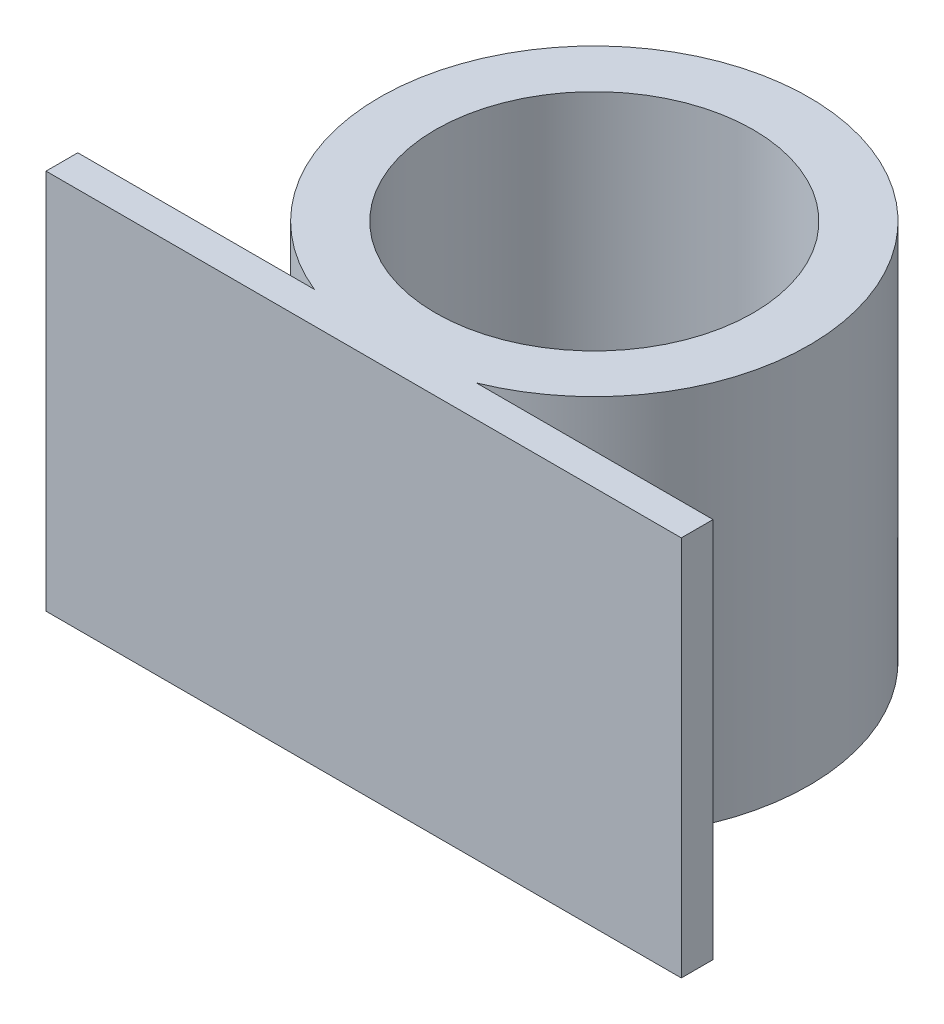
ISO-10303-21;
HEADER;
FILE_DESCRIPTION(('STEP AP214'),'2;1');
FILE_NAME('part.step','',(''),(''),'','','');
FILE_SCHEMA(('AUTOMOTIVE_DESIGN { 1 0 10303 214 1 1 1 1 }'));
ENDSEC;
DATA;
#1=APPLICATION_CONTEXT('core data for automotive mechanical design processes');
#2=APPLICATION_PROTOCOL_DEFINITION('international standard','automotive_design',2000,#1);
#3=PRODUCT_CONTEXT('',#1,'mechanical');
#4=PRODUCT('Part','Part','',(#3));
#5=PRODUCT_RELATED_PRODUCT_CATEGORY('part','',(#4));
#6=PRODUCT_DEFINITION_FORMATION('','',#4);
#7=PRODUCT_DEFINITION_CONTEXT('part definition',#1,'design');
#8=PRODUCT_DEFINITION('design','',#6,#7);
#9=PRODUCT_DEFINITION_SHAPE('','',#8);
#10=(LENGTH_UNIT() NAMED_UNIT(*) SI_UNIT(.MILLI.,.METRE.));
#11=(NAMED_UNIT(*) PLANE_ANGLE_UNIT() SI_UNIT($,.RADIAN.));
#12=(NAMED_UNIT(*) SI_UNIT($,.STERADIAN.) SOLID_ANGLE_UNIT());
#13=UNCERTAINTY_MEASURE_WITH_UNIT(LENGTH_MEASURE(1.E-05),#10,'distance_accuracy_value','');
#14=(GEOMETRIC_REPRESENTATION_CONTEXT(3) GLOBAL_UNCERTAINTY_ASSIGNED_CONTEXT((#13)) GLOBAL_UNIT_ASSIGNED_CONTEXT((#10,
#11,#12)) REPRESENTATION_CONTEXT('',''));
#15=CARTESIAN_POINT('',(0.,0.,0.));
#16=DIRECTION('',(0.,0.,1.));
#17=DIRECTION('',(1.,0.,0.));
#18=AXIS2_PLACEMENT_3D('',#15,#16,#17);
#19=CARTESIAN_POINT('',(0.,20.,0.));
#20=DIRECTION('',(0.,1.,0.));
#21=DIRECTION('',(0.,0.,1.));
#22=AXIS2_PLACEMENT_3D('',#19,#20,#21);
#23=PLANE('',#22);
#24=CARTESIAN_POINT('',(0.,20.,0.));
#25=DIRECTION('',(0.,1.,0.));
#26=DIRECTION('',(0.,0.,1.));
#27=AXIS2_PLACEMENT_3D('',#24,#25,#26);
#28=CIRCLE('',#27,13.5240640700952);
#29=CARTESIAN_POINT('',(5.10373668405712,20.,12.5240640700952));
#30=VERTEX_POINT('',#29);
#31=CARTESIAN_POINT('',(-5.10373668405712,20.,12.5240640700952));
#32=VERTEX_POINT('',#31);
#33=EDGE_CURVE('E136',#30,#32,#28,.T.);
#34=ORIENTED_EDGE('',*,*,#33,.T.);
#35=DIRECTION('',(-1.,0.,0.));
#36=VECTOR('',#35,1.);
#37=CARTESIAN_POINT('',(-20.,20.,12.5240640700952));
#38=LINE('',#37,#36);
#39=CARTESIAN_POINT('',(-20.,20.,12.5240640700952));
#40=VERTEX_POINT('',#39);
#41=EDGE_CURVE('E142',#32,#40,#38,.T.);
#42=ORIENTED_EDGE('',*,*,#41,.T.);
#43=DIRECTION('',(0.,0.,1.));
#44=VECTOR('',#43,1.);
#45=CARTESIAN_POINT('',(-20.,20.,12.5240640700952));
#46=LINE('',#45,#44);
#47=CARTESIAN_POINT('',(-20.,20.,14.5240640700952));
#48=VERTEX_POINT('',#47);
#49=EDGE_CURVE('E98',#40,#48,#46,.T.);
#50=ORIENTED_EDGE('',*,*,#49,.T.);
#51=DIRECTION('',(1.,0.,0.));
#52=VECTOR('',#51,1.);
#53=CARTESIAN_POINT('',(-20.,20.,14.5240640700952));
#54=LINE('',#53,#52);
#55=CARTESIAN_POINT('',(20.,20.,14.5240640700952));
#56=VERTEX_POINT('',#55);
#57=EDGE_CURVE('E147',#48,#56,#54,.T.);
#58=ORIENTED_EDGE('',*,*,#57,.T.);
#59=DIRECTION('',(0.,0.,-1.));
#60=VECTOR('',#59,1.);
#61=CARTESIAN_POINT('',(20.,20.,12.5240640700952));
#62=LINE('',#61,#60);
#63=CARTESIAN_POINT('',(20.,20.,12.5240640700952));
#64=VERTEX_POINT('',#63);
#65=EDGE_CURVE('E60',#56,#64,#62,.T.);
#66=ORIENTED_EDGE('',*,*,#65,.T.);
#67=DIRECTION('',(-1.,0.,0.));
#68=VECTOR('',#67,1.);
#69=CARTESIAN_POINT('',(5.10373668405712,20.,12.5240640700952));
#70=LINE('',#69,#68);
#71=EDGE_CURVE('E55',#64,#30,#70,.T.);
#72=ORIENTED_EDGE('',*,*,#71,.T.);
#73=EDGE_LOOP('',(#34,#42,#50,#58,#66,#72));
#74=FACE_BOUND('',#73,.T.);
#75=CARTESIAN_POINT('',(0.,20.,0.));
#76=DIRECTION('',(0.,1.,0.));
#77=DIRECTION('',(0.,0.,1.));
#78=AXIS2_PLACEMENT_3D('',#75,#76,#77);
#79=CIRCLE('',#78,10.);
#80=CARTESIAN_POINT('',(0.,20.,10.));
#81=VERTEX_POINT('',#80);
#82=EDGE_CURVE('E132',#81,#81,#79,.T.);
#83=ORIENTED_EDGE('',*,*,#82,.F.);
#84=EDGE_LOOP('',(#83));
#85=FACE_BOUND('',#84,.T.);
#86=ADVANCED_FACE('F39',(#74,#85),#23,.T.);
#87=CARTESIAN_POINT('',(0.,20.,0.));
#88=DIRECTION('',(0.,-1.,0.));
#89=DIRECTION('',(0.,0.,-1.));
#90=AXIS2_PLACEMENT_3D('',#87,#88,#89);
#91=CYLINDRICAL_SURFACE('',#90,13.5240640700952);
#92=DIRECTION('',(0.,-1.,0.));
#93=VECTOR('',#92,1.);
#94=CARTESIAN_POINT('',(5.10373668405712,20.,12.5240640700952));
#95=LINE('',#94,#93);
#96=CARTESIAN_POINT('',(5.10373668405712,-4.,12.5240640700952));
#97=VERTEX_POINT('',#96);
#98=EDGE_CURVE('E154',#30,#97,#95,.T.);
#99=ORIENTED_EDGE('',*,*,#98,.T.);
#100=CARTESIAN_POINT('',(0.,-4.,0.));
#101=DIRECTION('',(0.,-1.,0.));
#102=DIRECTION('',(0.,0.,-1.));
#103=AXIS2_PLACEMENT_3D('',#100,#101,#102);
#104=CIRCLE('',#103,13.5240640700952);
#105=CARTESIAN_POINT('',(-5.10373668405712,-4.,12.5240640700952));
#106=VERTEX_POINT('',#105);
#107=EDGE_CURVE('E110',#106,#97,#104,.T.);
#108=ORIENTED_EDGE('',*,*,#107,.F.);
#109=DIRECTION('',(0.,-1.,0.));
#110=VECTOR('',#109,1.);
#111=CARTESIAN_POINT('',(-5.10373668405712,20.,12.5240640700952));
#112=LINE('',#111,#110);
#113=EDGE_CURVE('E11',#32,#106,#112,.T.);
#114=ORIENTED_EDGE('',*,*,#113,.F.);
#115=ORIENTED_EDGE('',*,*,#33,.F.);
#116=EDGE_LOOP('',(#99,#108,#114,#115));
#117=FACE_BOUND('',#116,.T.);
#118=ADVANCED_FACE('F41',(#117),#91,.T.);
#119=CARTESIAN_POINT('',(-20.,20.,12.5240640700952));
#120=DIRECTION('',(0.,0.,1.));
#121=DIRECTION('',(1.,0.,0.));
#122=AXIS2_PLACEMENT_3D('',#119,#120,#121);
#123=PLANE('',#122);
#124=ORIENTED_EDGE('',*,*,#113,.T.);
#125=DIRECTION('',(1.,0.,0.));
#126=VECTOR('',#125,1.);
#127=CARTESIAN_POINT('',(-20.,-4.,12.5240640700952));
#128=LINE('',#127,#126);
#129=CARTESIAN_POINT('',(-20.,-4.,12.5240640700952));
#130=VERTEX_POINT('',#129);
#131=EDGE_CURVE('E103',#130,#106,#128,.T.);
#132=ORIENTED_EDGE('',*,*,#131,.F.);
#133=DIRECTION('',(0.,-1.,0.));
#134=VECTOR('',#133,1.);
#135=CARTESIAN_POINT('',(-20.,20.,12.5240640700952));
#136=LINE('',#135,#134);
#137=EDGE_CURVE('E48',#40,#130,#136,.T.);
#138=ORIENTED_EDGE('',*,*,#137,.F.);
#139=ORIENTED_EDGE('',*,*,#41,.F.);
#140=EDGE_LOOP('',(#124,#132,#138,#139));
#141=FACE_BOUND('',#140,.T.);
#142=ADVANCED_FACE('F104',(#141),#123,.F.);
#143=CARTESIAN_POINT('',(-20.,20.,12.5240640700952));
#144=DIRECTION('',(1.,0.,0.));
#145=DIRECTION('',(0.,0.,-1.));
#146=AXIS2_PLACEMENT_3D('',#143,#144,#145);
#147=PLANE('',#146);
#148=ORIENTED_EDGE('',*,*,#137,.T.);
#149=DIRECTION('',(0.,0.,-1.));
#150=VECTOR('',#149,1.);
#151=CARTESIAN_POINT('',(-20.,-4.,14.5240640700952));
#152=LINE('',#151,#150);
#153=CARTESIAN_POINT('',(-20.,-4.,14.5240640700952));
#154=VERTEX_POINT('',#153);
#155=EDGE_CURVE('E97',#154,#130,#152,.T.);
#156=ORIENTED_EDGE('',*,*,#155,.F.);
#157=DIRECTION('',(0.,-1.,0.));
#158=VECTOR('',#157,1.);
#159=CARTESIAN_POINT('',(-20.,20.,14.5240640700952));
#160=LINE('',#159,#158);
#161=EDGE_CURVE('E101',#48,#154,#160,.T.);
#162=ORIENTED_EDGE('',*,*,#161,.F.);
#163=ORIENTED_EDGE('',*,*,#49,.F.);
#164=EDGE_LOOP('',(#148,#156,#162,#163));
#165=FACE_BOUND('',#164,.T.);
#166=ADVANCED_FACE('F94',(#165),#147,.F.);
#167=CARTESIAN_POINT('',(-20.,20.,14.5240640700952));
#168=DIRECTION('',(0.,0.,-1.));
#169=DIRECTION('',(-1.,0.,0.));
#170=AXIS2_PLACEMENT_3D('',#167,#168,#169);
#171=PLANE('',#170);
#172=ORIENTED_EDGE('',*,*,#161,.T.);
#173=DIRECTION('',(-1.,0.,0.));
#174=VECTOR('',#173,1.);
#175=CARTESIAN_POINT('',(-20.,-4.,14.5240640700952));
#176=LINE('',#175,#174);
#177=CARTESIAN_POINT('',(20.,-4.,14.5240640700952));
#178=VERTEX_POINT('',#177);
#179=EDGE_CURVE('E116',#178,#154,#176,.T.);
#180=ORIENTED_EDGE('',*,*,#179,.F.);
#181=DIRECTION('',(0.,-1.,0.));
#182=VECTOR('',#181,1.);
#183=CARTESIAN_POINT('',(20.,20.,14.5240640700952));
#184=LINE('',#183,#182);
#185=EDGE_CURVE('E160',#56,#178,#184,.T.);
#186=ORIENTED_EDGE('',*,*,#185,.F.);
#187=ORIENTED_EDGE('',*,*,#57,.F.);
#188=EDGE_LOOP('',(#172,#180,#186,#187));
#189=FACE_BOUND('',#188,.T.);
#190=ADVANCED_FACE('F166',(#189),#171,.F.);
#191=CARTESIAN_POINT('',(20.,20.,12.5240640700952));
#192=DIRECTION('',(-1.,0.,0.));
#193=DIRECTION('',(0.,0.,1.));
#194=AXIS2_PLACEMENT_3D('',#191,#192,#193);
#195=PLANE('',#194);
#196=ORIENTED_EDGE('',*,*,#185,.T.);
#197=DIRECTION('',(0.,0.,1.));
#198=VECTOR('',#197,1.);
#199=CARTESIAN_POINT('',(20.,-4.,14.5240640700952));
#200=LINE('',#199,#198);
#201=CARTESIAN_POINT('',(20.,-4.,12.5240640700952));
#202=VERTEX_POINT('',#201);
#203=EDGE_CURVE('E126',#202,#178,#200,.T.);
#204=ORIENTED_EDGE('',*,*,#203,.F.);
#205=DIRECTION('',(0.,-1.,0.));
#206=VECTOR('',#205,1.);
#207=CARTESIAN_POINT('',(20.,20.,12.5240640700952));
#208=LINE('',#207,#206);
#209=EDGE_CURVE('E157',#64,#202,#208,.T.);
#210=ORIENTED_EDGE('',*,*,#209,.F.);
#211=ORIENTED_EDGE('',*,*,#65,.F.);
#212=EDGE_LOOP('',(#196,#204,#210,#211));
#213=FACE_BOUND('',#212,.T.);
#214=ADVANCED_FACE('F176',(#213),#195,.F.);
#215=CARTESIAN_POINT('',(5.10373668405712,20.,12.5240640700952));
#216=DIRECTION('',(0.,0.,1.));
#217=DIRECTION('',(1.,0.,0.));
#218=AXIS2_PLACEMENT_3D('',#215,#216,#217);
#219=PLANE('',#218);
#220=ORIENTED_EDGE('',*,*,#209,.T.);
#221=DIRECTION('',(1.,0.,0.));
#222=VECTOR('',#221,1.);
#223=CARTESIAN_POINT('',(5.10373668405712,-4.,12.5240640700952));
#224=LINE('',#223,#222);
#225=EDGE_CURVE('E122',#97,#202,#224,.T.);
#226=ORIENTED_EDGE('',*,*,#225,.F.);
#227=ORIENTED_EDGE('',*,*,#98,.F.);
#228=ORIENTED_EDGE('',*,*,#71,.F.);
#229=EDGE_LOOP('',(#220,#226,#227,#228));
#230=FACE_BOUND('',#229,.T.);
#231=ADVANCED_FACE('F174',(#230),#219,.F.);
#232=CARTESIAN_POINT('',(0.,20.,0.));
#233=DIRECTION('',(0.,-1.,0.));
#234=DIRECTION('',(0.,0.,-1.));
#235=AXIS2_PLACEMENT_3D('',#232,#233,#234);
#236=CYLINDRICAL_SURFACE('',#235,10.);
#237=ORIENTED_EDGE('',*,*,#82,.T.);
#238=EDGE_LOOP('',(#237));
#239=FACE_BOUND('',#238,.T.);
#240=CARTESIAN_POINT('',(0.,0.,0.));
#241=DIRECTION('',(0.,1.,0.));
#242=DIRECTION('',(0.,0.,1.));
#243=AXIS2_PLACEMENT_3D('',#240,#241,#242);
#244=CIRCLE('',#243,10.);
#245=CARTESIAN_POINT('',(0.,0.,10.));
#246=VERTEX_POINT('',#245);
#247=EDGE_CURVE('E131',#246,#246,#244,.T.);
#248=ORIENTED_EDGE('',*,*,#247,.F.);
#249=EDGE_LOOP('',(#248));
#250=FACE_BOUND('',#249,.T.);
#251=ADVANCED_FACE('F183',(#239,#250),#236,.F.);
#252=CARTESIAN_POINT('',(0.,0.,0.));
#253=DIRECTION('',(0.,-1.,0.));
#254=DIRECTION('',(0.,0.,-1.));
#255=AXIS2_PLACEMENT_3D('',#252,#253,#254);
#256=PLANE('',#255);
#257=ORIENTED_EDGE('',*,*,#247,.T.);
#258=EDGE_LOOP('',(#257));
#259=FACE_BOUND('',#258,.T.);
#260=ADVANCED_FACE('F194',(#259),#256,.F.);
#261=CARTESIAN_POINT('',(0.,-4.,0.));
#262=DIRECTION('',(0.,-1.,0.));
#263=DIRECTION('',(0.,0.,-1.));
#264=AXIS2_PLACEMENT_3D('',#261,#262,#263);
#265=PLANE('',#264);
#266=ORIENTED_EDGE('',*,*,#155,.T.);
#267=ORIENTED_EDGE('',*,*,#131,.T.);
#268=ORIENTED_EDGE('',*,*,#107,.T.);
#269=ORIENTED_EDGE('',*,*,#225,.T.);
#270=ORIENTED_EDGE('',*,*,#203,.T.);
#271=ORIENTED_EDGE('',*,*,#179,.T.);
#272=EDGE_LOOP('',(#266,#267,#268,#269,#270,#271));
#273=FACE_BOUND('',#272,.T.);
#274=ADVANCED_FACE('F113',(#273),#265,.T.);
#275=CLOSED_SHELL('',(#86,#118,#142,#166,#190,#214,#231,#251,#260,#274));
#276=MANIFOLD_SOLID_BREP('B2',#275);
#277=ADVANCED_BREP_SHAPE_REPRESENTATION('',(#18,#276),#14);
#278=SHAPE_DEFINITION_REPRESENTATION(#9,#277);
ENDSEC;
END-ISO-10303-21;
